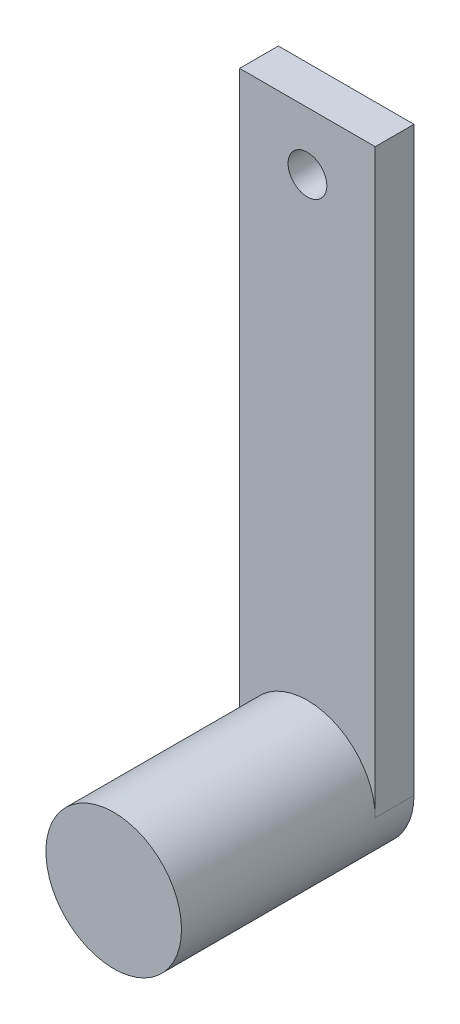
ISO-10303-21;
HEADER;
FILE_DESCRIPTION(('STEP AP214'),'2;1');
FILE_NAME('part.step','',(''),(''),'','','');
FILE_SCHEMA(('AUTOMOTIVE_DESIGN { 1 0 10303 214 1 1 1 1 }'));
ENDSEC;
DATA;
#1=APPLICATION_CONTEXT('core data for automotive mechanical design processes');
#2=APPLICATION_PROTOCOL_DEFINITION('international standard','automotive_design',2000,#1);
#3=PRODUCT_CONTEXT('',#1,'mechanical');
#4=PRODUCT('Part','Part','',(#3));
#5=PRODUCT_RELATED_PRODUCT_CATEGORY('part','',(#4));
#6=PRODUCT_DEFINITION_FORMATION('','',#4);
#7=PRODUCT_DEFINITION_CONTEXT('part definition',#1,'design');
#8=PRODUCT_DEFINITION('design','',#6,#7);
#9=PRODUCT_DEFINITION_SHAPE('','',#8);
#10=(LENGTH_UNIT() NAMED_UNIT(*) SI_UNIT(.MILLI.,.METRE.));
#11=(NAMED_UNIT(*) PLANE_ANGLE_UNIT() SI_UNIT($,.RADIAN.));
#12=(NAMED_UNIT(*) SI_UNIT($,.STERADIAN.) SOLID_ANGLE_UNIT());
#13=UNCERTAINTY_MEASURE_WITH_UNIT(LENGTH_MEASURE(1.E-05),#10,'distance_accuracy_value','');
#14=(GEOMETRIC_REPRESENTATION_CONTEXT(3) GLOBAL_UNCERTAINTY_ASSIGNED_CONTEXT((#13)) GLOBAL_UNIT_ASSIGNED_CONTEXT((#10,
#11,#12)) REPRESENTATION_CONTEXT('',''));
#15=CARTESIAN_POINT('',(0.,0.,0.));
#16=DIRECTION('',(0.,0.,1.));
#17=DIRECTION('',(1.,0.,0.));
#18=AXIS2_PLACEMENT_3D('',#15,#16,#17);
#19=CARTESIAN_POINT('',(0.,0.,10.));
#20=DIRECTION('',(0.,0.,-1.));
#21=DIRECTION('',(-1.,0.,0.));
#22=AXIS2_PLACEMENT_3D('',#19,#20,#21);
#23=CYLINDRICAL_SURFACE('',#22,3.5);
#24=CARTESIAN_POINT('',(0.,0.,10.));
#25=DIRECTION('',(0.,0.,1.));
#26=DIRECTION('',(1.,0.,0.));
#27=AXIS2_PLACEMENT_3D('',#24,#25,#26);
#28=CIRCLE('',#27,3.5);
#29=CARTESIAN_POINT('',(3.5,0.,10.));
#30=VERTEX_POINT('',#29);
#31=EDGE_CURVE('E12',#30,#30,#28,.T.);
#32=ORIENTED_EDGE('',*,*,#31,.F.);
#33=EDGE_LOOP('',(#32));
#34=FACE_BOUND('',#33,.T.);
#35=CARTESIAN_POINT('',(0.,0.,0.));
#36=DIRECTION('',(0.,0.,1.));
#37=DIRECTION('',(1.,0.,0.));
#38=AXIS2_PLACEMENT_3D('',#35,#36,#37);
#39=CIRCLE('',#38,3.5);
#40=CARTESIAN_POINT('',(3.5,0.,0.));
#41=VERTEX_POINT('',#40);
#42=CARTESIAN_POINT('',(-3.5,0.,0.));
#43=VERTEX_POINT('',#42);
#44=EDGE_CURVE('E51',#41,#43,#39,.T.);
#45=ORIENTED_EDGE('',*,*,#44,.T.);
#46=DIRECTION('',(0.,0.,1.));
#47=VECTOR('',#46,1.);
#48=CARTESIAN_POINT('',(-3.5,0.,-2.));
#49=LINE('',#48,#47);
#50=CARTESIAN_POINT('',(-3.5,0.,-2.));
#51=VERTEX_POINT('',#50);
#52=EDGE_CURVE('E102',#51,#43,#49,.T.);
#53=ORIENTED_EDGE('',*,*,#52,.F.);
#54=CARTESIAN_POINT('',(0.,0.,-2.));
#55=DIRECTION('',(0.,0.,-1.));
#56=DIRECTION('',(-1.,0.,0.));
#57=AXIS2_PLACEMENT_3D('',#54,#55,#56);
#58=CIRCLE('',#57,3.5);
#59=CARTESIAN_POINT('',(3.5,0.,-2.));
#60=VERTEX_POINT('',#59);
#61=EDGE_CURVE('E88',#60,#51,#58,.T.);
#62=ORIENTED_EDGE('',*,*,#61,.F.);
#63=DIRECTION('',(0.,0.,1.));
#64=VECTOR('',#63,1.);
#65=CARTESIAN_POINT('',(3.5,0.,-2.));
#66=LINE('',#65,#64);
#67=EDGE_CURVE('E67',#60,#41,#66,.T.);
#68=ORIENTED_EDGE('',*,*,#67,.T.);
#69=EDGE_LOOP('',(#45,#53,#62,#68));
#70=FACE_BOUND('',#69,.T.);
#71=ADVANCED_FACE('F48',(#34,#70),#23,.T.);
#72=CARTESIAN_POINT('',(0.,0.,10.));
#73=DIRECTION('',(0.,0.,1.));
#74=DIRECTION('',(1.,0.,0.));
#75=AXIS2_PLACEMENT_3D('',#72,#73,#74);
#76=PLANE('',#75);
#77=ORIENTED_EDGE('',*,*,#31,.T.);
#78=EDGE_LOOP('',(#77));
#79=FACE_BOUND('',#78,.T.);
#80=ADVANCED_FACE('F141',(#79),#76,.T.);
#81=CARTESIAN_POINT('',(0.,0.,-2.));
#82=DIRECTION('',(0.,0.,-1.));
#83=DIRECTION('',(-1.,0.,0.));
#84=AXIS2_PLACEMENT_3D('',#81,#82,#83);
#85=PLANE('',#84);
#86=ORIENTED_EDGE('',*,*,#61,.T.);
#87=DIRECTION('',(0.,-1.,0.));
#88=VECTOR('',#87,1.);
#89=CARTESIAN_POINT('',(-3.5,30.,-2.));
#90=LINE('',#89,#88);
#91=CARTESIAN_POINT('',(-3.5,30.,-2.));
#92=VERTEX_POINT('',#91);
#93=EDGE_CURVE('E96',#92,#51,#90,.T.);
#94=ORIENTED_EDGE('',*,*,#93,.F.);
#95=DIRECTION('',(-1.,0.,0.));
#96=VECTOR('',#95,1.);
#97=CARTESIAN_POINT('',(3.5,30.,-2.));
#98=LINE('',#97,#96);
#99=CARTESIAN_POINT('',(3.5,30.,-2.));
#100=VERTEX_POINT('',#99);
#101=EDGE_CURVE('E107',#100,#92,#98,.T.);
#102=ORIENTED_EDGE('',*,*,#101,.F.);
#103=DIRECTION('',(0.,1.,0.));
#104=VECTOR('',#103,1.);
#105=CARTESIAN_POINT('',(3.5,0.,-2.));
#106=LINE('',#105,#104);
#107=EDGE_CURVE('E110',#60,#100,#106,.T.);
#108=ORIENTED_EDGE('',*,*,#107,.F.);
#109=EDGE_LOOP('',(#86,#94,#102,#108));
#110=FACE_BOUND('',#109,.T.);
#111=CARTESIAN_POINT('',(-3.43041567374414E-12,27.,-2.));
#112=DIRECTION('',(0.,0.,-1.));
#113=DIRECTION('',(-1.,0.,0.));
#114=AXIS2_PLACEMENT_3D('',#111,#112,#113);
#115=CIRCLE('',#114,1.);
#116=CARTESIAN_POINT('',(-1.00000000000343,27.,-2.));
#117=VERTEX_POINT('',#116);
#118=EDGE_CURVE('E117',#117,#117,#115,.T.);
#119=ORIENTED_EDGE('',*,*,#118,.F.);
#120=EDGE_LOOP('',(#119));
#121=FACE_BOUND('',#120,.T.);
#122=ADVANCED_FACE('F105',(#110,#121),#85,.T.);
#123=CARTESIAN_POINT('',(0.,0.,0.));
#124=DIRECTION('',(0.,0.,-1.));
#125=DIRECTION('',(-1.,0.,0.));
#126=AXIS2_PLACEMENT_3D('',#123,#124,#125);
#127=PLANE('',#126);
#128=ORIENTED_EDGE('',*,*,#44,.F.);
#129=DIRECTION('',(0.,1.,0.));
#130=VECTOR('',#129,1.);
#131=CARTESIAN_POINT('',(3.5,0.,0.));
#132=LINE('',#131,#130);
#133=CARTESIAN_POINT('',(3.5,30.,0.));
#134=VERTEX_POINT('',#133);
#135=EDGE_CURVE('E62',#41,#134,#132,.T.);
#136=ORIENTED_EDGE('',*,*,#135,.T.);
#137=DIRECTION('',(-1.,0.,0.));
#138=VECTOR('',#137,1.);
#139=CARTESIAN_POINT('',(3.5,30.,0.));
#140=LINE('',#139,#138);
#141=CARTESIAN_POINT('',(-3.5,30.,0.));
#142=VERTEX_POINT('',#141);
#143=EDGE_CURVE('E116',#134,#142,#140,.T.);
#144=ORIENTED_EDGE('',*,*,#143,.T.);
#145=DIRECTION('',(0.,-1.,0.));
#146=VECTOR('',#145,1.);
#147=CARTESIAN_POINT('',(-3.5,30.,0.));
#148=LINE('',#147,#146);
#149=EDGE_CURVE('E98',#142,#43,#148,.T.);
#150=ORIENTED_EDGE('',*,*,#149,.T.);
#151=EDGE_LOOP('',(#128,#136,#144,#150));
#152=FACE_BOUND('',#151,.T.);
#153=CARTESIAN_POINT('',(-3.43041567374414E-12,27.,0.));
#154=DIRECTION('',(0.,0.,-1.));
#155=DIRECTION('',(-1.,0.,0.));
#156=AXIS2_PLACEMENT_3D('',#153,#154,#155);
#157=CIRCLE('',#156,1.);
#158=CARTESIAN_POINT('',(-1.00000000000343,27.,0.));
#159=VERTEX_POINT('',#158);
#160=EDGE_CURVE('E132',#159,#159,#157,.T.);
#161=ORIENTED_EDGE('',*,*,#160,.T.);
#162=EDGE_LOOP('',(#161));
#163=FACE_BOUND('',#162,.T.);
#164=ADVANCED_FACE('F126',(#152,#163),#127,.F.);
#165=CARTESIAN_POINT('',(-3.5,30.,-2.));
#166=DIRECTION('',(-1.,0.,0.));
#167=DIRECTION('',(0.,-1.,0.));
#168=AXIS2_PLACEMENT_3D('',#165,#166,#167);
#169=PLANE('',#168);
#170=ORIENTED_EDGE('',*,*,#149,.F.);
#171=DIRECTION('',(0.,0.,1.));
#172=VECTOR('',#171,1.);
#173=CARTESIAN_POINT('',(-3.5,30.,-2.));
#174=LINE('',#173,#172);
#175=EDGE_CURVE('E94',#92,#142,#174,.T.);
#176=ORIENTED_EDGE('',*,*,#175,.F.);
#177=ORIENTED_EDGE('',*,*,#93,.T.);
#178=ORIENTED_EDGE('',*,*,#52,.T.);
#179=EDGE_LOOP('',(#170,#176,#177,#178));
#180=FACE_BOUND('',#179,.T.);
#181=ADVANCED_FACE('F95',(#180),#169,.T.);
#182=CARTESIAN_POINT('',(3.5,30.,-2.));
#183=DIRECTION('',(0.,1.,0.));
#184=DIRECTION('',(0.,0.,1.));
#185=AXIS2_PLACEMENT_3D('',#182,#183,#184);
#186=PLANE('',#185);
#187=ORIENTED_EDGE('',*,*,#143,.F.);
#188=DIRECTION('',(0.,0.,1.));
#189=VECTOR('',#188,1.);
#190=CARTESIAN_POINT('',(3.5,30.,-2.));
#191=LINE('',#190,#189);
#192=EDGE_CURVE('E81',#100,#134,#191,.T.);
#193=ORIENTED_EDGE('',*,*,#192,.F.);
#194=ORIENTED_EDGE('',*,*,#101,.T.);
#195=ORIENTED_EDGE('',*,*,#175,.T.);
#196=EDGE_LOOP('',(#187,#193,#194,#195));
#197=FACE_BOUND('',#196,.T.);
#198=ADVANCED_FACE('F109',(#197),#186,.T.);
#199=CARTESIAN_POINT('',(3.5,0.,-2.));
#200=DIRECTION('',(1.,0.,0.));
#201=DIRECTION('',(0.,0.,-1.));
#202=AXIS2_PLACEMENT_3D('',#199,#200,#201);
#203=PLANE('',#202);
#204=ORIENTED_EDGE('',*,*,#135,.F.);
#205=ORIENTED_EDGE('',*,*,#67,.F.);
#206=ORIENTED_EDGE('',*,*,#107,.T.);
#207=ORIENTED_EDGE('',*,*,#192,.T.);
#208=EDGE_LOOP('',(#204,#205,#206,#207));
#209=FACE_BOUND('',#208,.T.);
#210=ADVANCED_FACE('F188',(#209),#203,.T.);
#211=CARTESIAN_POINT('',(-3.43041567374414E-12,27.,-2.));
#212=DIRECTION('',(0.,0.,1.));
#213=DIRECTION('',(1.,0.,0.));
#214=AXIS2_PLACEMENT_3D('',#211,#212,#213);
#215=CYLINDRICAL_SURFACE('',#214,1.);
#216=ORIENTED_EDGE('',*,*,#118,.T.);
#217=EDGE_LOOP('',(#216));
#218=FACE_BOUND('',#217,.T.);
#219=ORIENTED_EDGE('',*,*,#160,.F.);
#220=EDGE_LOOP('',(#219));
#221=FACE_BOUND('',#220,.T.);
#222=ADVANCED_FACE('F139',(#218,#221),#215,.F.);
#223=CLOSED_SHELL('',(#71,#80,#122,#164,#181,#198,#210,#222));
#224=MANIFOLD_SOLID_BREP('B2',#223);
#225=ADVANCED_BREP_SHAPE_REPRESENTATION('',(#18,#224),#14);
#226=SHAPE_DEFINITION_REPRESENTATION(#9,#225);
ENDSEC;
END-ISO-10303-21;
